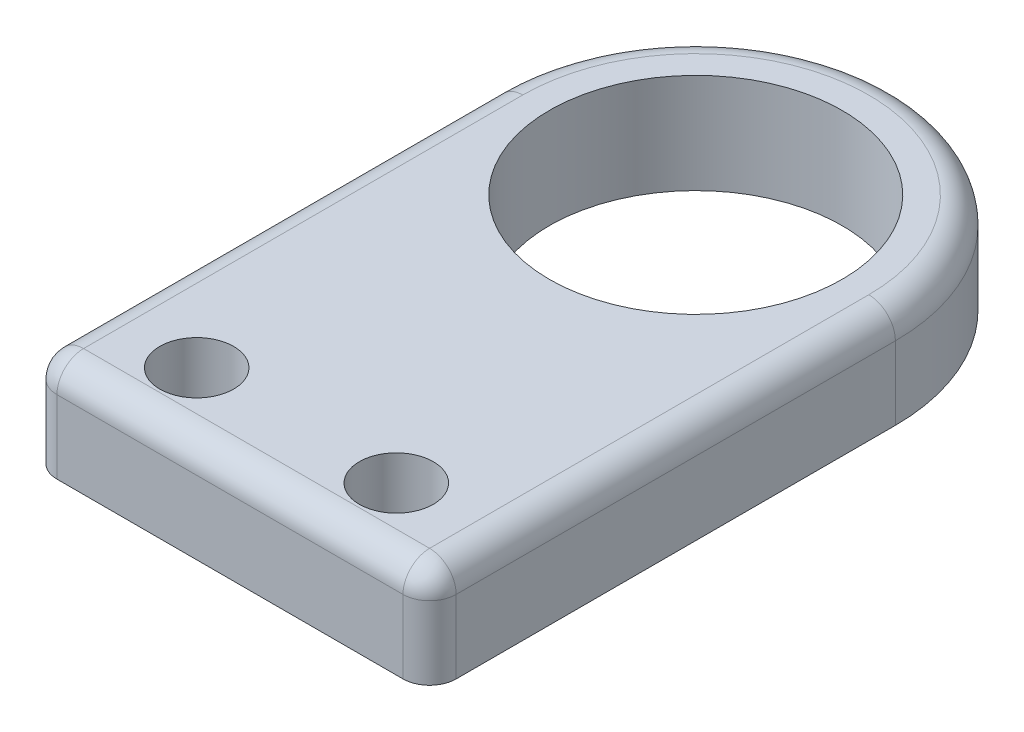
ISO-10303-21;
HEADER;
FILE_DESCRIPTION(('STEP AP214'),'2;1');
FILE_NAME('part.step','',(''),(''),'','','');
FILE_SCHEMA(('AUTOMOTIVE_DESIGN { 1 0 10303 214 1 1 1 1 }'));
ENDSEC;
DATA;
#1=APPLICATION_CONTEXT('core data for automotive mechanical design processes');
#2=APPLICATION_PROTOCOL_DEFINITION('international standard','automotive_design',2000,#1);
#3=PRODUCT_CONTEXT('',#1,'mechanical');
#4=PRODUCT('Part','Part','',(#3));
#5=PRODUCT_RELATED_PRODUCT_CATEGORY('part','',(#4));
#6=PRODUCT_DEFINITION_FORMATION('','',#4);
#7=PRODUCT_DEFINITION_CONTEXT('part definition',#1,'design');
#8=PRODUCT_DEFINITION('design','',#6,#7);
#9=PRODUCT_DEFINITION_SHAPE('','',#8);
#10=(LENGTH_UNIT() NAMED_UNIT(*) SI_UNIT(.MILLI.,.METRE.));
#11=(NAMED_UNIT(*) PLANE_ANGLE_UNIT() SI_UNIT($,.RADIAN.));
#12=(NAMED_UNIT(*) SI_UNIT($,.STERADIAN.) SOLID_ANGLE_UNIT());
#13=UNCERTAINTY_MEASURE_WITH_UNIT(LENGTH_MEASURE(1.E-05),#10,'distance_accuracy_value','');
#14=(GEOMETRIC_REPRESENTATION_CONTEXT(3) GLOBAL_UNCERTAINTY_ASSIGNED_CONTEXT((#13)) GLOBAL_UNIT_ASSIGNED_CONTEXT((#10,
#11,#12)) REPRESENTATION_CONTEXT('',''));
#15=CARTESIAN_POINT('',(0.,0.,0.));
#16=DIRECTION('',(0.,0.,1.));
#17=DIRECTION('',(1.,0.,0.));
#18=AXIS2_PLACEMENT_3D('',#15,#16,#17);
#19=CARTESIAN_POINT('',(0.,7.5,-35.));
#20=DIRECTION('',(0.,-1.,0.));
#21=DIRECTION('',(0.,0.,-1.));
#22=AXIS2_PLACEMENT_3D('',#19,#20,#21);
#23=PLANE('',#22);
#24=CARTESIAN_POINT('',(0.,7.5,-35.));
#25=DIRECTION('',(0.,-1.,0.));
#26=DIRECTION('',(0.,0.,-1.));
#27=AXIS2_PLACEMENT_3D('',#24,#25,#26);
#28=CIRCLE('',#27,13.);
#29=CARTESIAN_POINT('',(13.,7.5,-35.));
#30=VERTEX_POINT('',#29);
#31=CARTESIAN_POINT('',(-13.,7.5,-35.));
#32=VERTEX_POINT('',#31);
#33=EDGE_CURVE('E136',#30,#32,#28,.F.);
#34=ORIENTED_EDGE('',*,*,#33,.T.);
#35=DIRECTION('',(0.,0.,1.));
#36=VECTOR('',#35,1.);
#37=CARTESIAN_POINT('',(-13.,7.5,-35.));
#38=LINE('',#37,#36);
#39=CARTESIAN_POINT('',(-13.,7.5,-2.));
#40=VERTEX_POINT('',#39);
#41=EDGE_CURVE('E138',#32,#40,#38,.T.);
#42=ORIENTED_EDGE('',*,*,#41,.T.);
#43=DIRECTION('',(1.,0.,0.));
#44=VECTOR('',#43,1.);
#45=CARTESIAN_POINT('',(0.,7.5,-2.));
#46=LINE('',#45,#44);
#47=CARTESIAN_POINT('',(13.,7.5,-2.));
#48=VERTEX_POINT('',#47);
#49=EDGE_CURVE('E134',#40,#48,#46,.T.);
#50=ORIENTED_EDGE('',*,*,#49,.T.);
#51=DIRECTION('',(0.,0.,-1.));
#52=VECTOR('',#51,1.);
#53=CARTESIAN_POINT('',(13.,7.5,-35.));
#54=LINE('',#53,#52);
#55=EDGE_CURVE('E111',#48,#30,#54,.T.);
#56=ORIENTED_EDGE('',*,*,#55,.T.);
#57=EDGE_LOOP('',(#34,#42,#50,#56));
#58=FACE_BOUND('',#57,.T.);
#59=CARTESIAN_POINT('',(-7.5,7.5,-5.));
#60=DIRECTION('',(0.,1.,0.));
#61=DIRECTION('',(0.,0.,1.));
#62=AXIS2_PLACEMENT_3D('',#59,#60,#61);
#63=CIRCLE('',#62,2.77876);
#64=CARTESIAN_POINT('',(-7.5,7.5,-2.22124));
#65=VERTEX_POINT('',#64);
#66=EDGE_CURVE('E177',#65,#65,#63,.T.);
#67=ORIENTED_EDGE('',*,*,#66,.F.);
#68=EDGE_LOOP('',(#67));
#69=FACE_BOUND('',#68,.T.);
#70=CARTESIAN_POINT('',(7.5,7.5,-5.));
#71=DIRECTION('',(0.,1.,0.));
#72=DIRECTION('',(0.,0.,1.));
#73=AXIS2_PLACEMENT_3D('',#70,#71,#72);
#74=CIRCLE('',#73,2.77876);
#75=CARTESIAN_POINT('',(7.5,7.5,-2.22124));
#76=VERTEX_POINT('',#75);
#77=EDGE_CURVE('E131',#76,#76,#74,.T.);
#78=ORIENTED_EDGE('',*,*,#77,.F.);
#79=EDGE_LOOP('',(#78));
#80=FACE_BOUND('',#79,.T.);
#81=CARTESIAN_POINT('',(0.,7.5,-35.));
#82=DIRECTION('',(0.,1.,0.));
#83=DIRECTION('',(0.,0.,1.));
#84=AXIS2_PLACEMENT_3D('',#81,#82,#83);
#85=CIRCLE('',#84,11.);
#86=CARTESIAN_POINT('',(0.,7.5,-24.));
#87=VERTEX_POINT('',#86);
#88=EDGE_CURVE('E198',#87,#87,#85,.T.);
#89=ORIENTED_EDGE('',*,*,#88,.F.);
#90=EDGE_LOOP('',(#89));
#91=FACE_BOUND('',#90,.T.);
#92=ADVANCED_FACE('F32',(#58,#69,#80,#91),#23,.F.);
#93=CARTESIAN_POINT('',(0.,0.,-35.));
#94=DIRECTION('',(0.,-1.,0.));
#95=DIRECTION('',(0.,0.,-1.));
#96=AXIS2_PLACEMENT_3D('',#93,#94,#95);
#97=PLANE('',#96);
#98=CARTESIAN_POINT('',(-7.5,0.,-5.));
#99=DIRECTION('',(0.,-1.,0.));
#100=DIRECTION('',(0.,0.,-1.));
#101=AXIS2_PLACEMENT_3D('',#98,#99,#100);
#102=CIRCLE('',#101,1.2192);
#103=CARTESIAN_POINT('',(-7.5,0.,-6.2192));
#104=VERTEX_POINT('',#103);
#105=EDGE_CURVE('E128',#104,#104,#102,.T.);
#106=ORIENTED_EDGE('',*,*,#105,.F.);
#107=EDGE_LOOP('',(#106));
#108=FACE_BOUND('',#107,.T.);
#109=CARTESIAN_POINT('',(7.5,0.,-5.));
#110=DIRECTION('',(0.,-1.,0.));
#111=DIRECTION('',(0.,0.,-1.));
#112=AXIS2_PLACEMENT_3D('',#109,#110,#111);
#113=CIRCLE('',#112,1.2192);
#114=CARTESIAN_POINT('',(7.5,0.,-6.2192));
#115=VERTEX_POINT('',#114);
#116=EDGE_CURVE('E123',#115,#115,#113,.T.);
#117=ORIENTED_EDGE('',*,*,#116,.F.);
#118=EDGE_LOOP('',(#117));
#119=FACE_BOUND('',#118,.T.);
#120=DIRECTION('',(1.,0.,0.));
#121=VECTOR('',#120,1.);
#122=CARTESIAN_POINT('',(-15.,0.,0.));
#123=LINE('',#122,#121);
#124=CARTESIAN_POINT('',(-13.,0.,0.));
#125=VERTEX_POINT('',#124);
#126=CARTESIAN_POINT('',(13.,0.,0.));
#127=VERTEX_POINT('',#126);
#128=EDGE_CURVE('E102',#125,#127,#123,.T.);
#129=ORIENTED_EDGE('',*,*,#128,.F.);
#130=CARTESIAN_POINT('',(-13.,0.,-2.));
#131=DIRECTION('',(0.,-1.,0.));
#132=DIRECTION('',(0.,0.,-1.));
#133=AXIS2_PLACEMENT_3D('',#130,#131,#132);
#134=CIRCLE('',#133,2.);
#135=CARTESIAN_POINT('',(-15.,0.,-2.));
#136=VERTEX_POINT('',#135);
#137=EDGE_CURVE('E11',#125,#136,#134,.T.);
#138=ORIENTED_EDGE('',*,*,#137,.T.);
#139=DIRECTION('',(0.,0.,1.));
#140=VECTOR('',#139,1.);
#141=CARTESIAN_POINT('',(-15.,0.,0.));
#142=LINE('',#141,#140);
#143=CARTESIAN_POINT('',(-15.,0.,-35.));
#144=VERTEX_POINT('',#143);
#145=EDGE_CURVE('E118',#144,#136,#142,.T.);
#146=ORIENTED_EDGE('',*,*,#145,.F.);
#147=CARTESIAN_POINT('',(0.,0.,-35.));
#148=DIRECTION('',(0.,1.,0.));
#149=DIRECTION('',(0.,0.,-1.));
#150=AXIS2_PLACEMENT_3D('',#147,#148,#149);
#151=CIRCLE('',#150,15.);
#152=CARTESIAN_POINT('',(15.,0.,-35.));
#153=VERTEX_POINT('',#152);
#154=EDGE_CURVE('E101',#153,#144,#151,.T.);
#155=ORIENTED_EDGE('',*,*,#154,.F.);
#156=DIRECTION('',(0.,0.,-1.));
#157=VECTOR('',#156,1.);
#158=CARTESIAN_POINT('',(15.,0.,0.));
#159=LINE('',#158,#157);
#160=CARTESIAN_POINT('',(15.,0.,-2.00000000000001));
#161=VERTEX_POINT('',#160);
#162=EDGE_CURVE('E94',#161,#153,#159,.T.);
#163=ORIENTED_EDGE('',*,*,#162,.F.);
#164=CARTESIAN_POINT('',(13.,0.,-2.00000000000001));
#165=DIRECTION('',(0.,-1.,0.));
#166=DIRECTION('',(0.,0.,-1.));
#167=AXIS2_PLACEMENT_3D('',#164,#165,#166);
#168=CIRCLE('',#167,2.);
#169=EDGE_CURVE('E41',#161,#127,#168,.T.);
#170=ORIENTED_EDGE('',*,*,#169,.T.);
#171=EDGE_LOOP('',(#129,#138,#146,#155,#163,#170));
#172=FACE_BOUND('',#171,.T.);
#173=CARTESIAN_POINT('',(0.,0.,-35.));
#174=DIRECTION('',(0.,1.,0.));
#175=DIRECTION('',(0.,0.,1.));
#176=AXIS2_PLACEMENT_3D('',#173,#174,#175);
#177=CIRCLE('',#176,11.);
#178=CARTESIAN_POINT('',(0.,0.,-24.));
#179=VERTEX_POINT('',#178);
#180=EDGE_CURVE('E126',#179,#179,#177,.T.);
#181=ORIENTED_EDGE('',*,*,#180,.T.);
#182=EDGE_LOOP('',(#181));
#183=FACE_BOUND('',#182,.T.);
#184=ADVANCED_FACE('F115',(#108,#119,#172,#183),#97,.T.);
#185=CARTESIAN_POINT('',(-15.,7.5,0.));
#186=DIRECTION('',(1.,0.,0.));
#187=DIRECTION('',(0.,0.,-1.));
#188=AXIS2_PLACEMENT_3D('',#185,#186,#187);
#189=PLANE('',#188);
#190=DIRECTION('',(0.,-1.,0.));
#191=VECTOR('',#190,1.);
#192=CARTESIAN_POINT('',(-15.,7.5,-2.));
#193=LINE('',#192,#191);
#194=CARTESIAN_POINT('',(-15.,5.5,-2.));
#195=VERTEX_POINT('',#194);
#196=EDGE_CURVE('E141',#136,#195,#193,.F.);
#197=ORIENTED_EDGE('',*,*,#196,.T.);
#198=DIRECTION('',(0.,0.,1.));
#199=VECTOR('',#198,1.);
#200=CARTESIAN_POINT('',(-15.,5.5,0.));
#201=LINE('',#200,#199);
#202=CARTESIAN_POINT('',(-15.,5.5,-35.));
#203=VERTEX_POINT('',#202);
#204=EDGE_CURVE('E143',#195,#203,#201,.F.);
#205=ORIENTED_EDGE('',*,*,#204,.T.);
#206=DIRECTION('',(0.,-1.,0.));
#207=VECTOR('',#206,1.);
#208=CARTESIAN_POINT('',(-15.,7.5,-35.));
#209=LINE('',#208,#207);
#210=EDGE_CURVE('E112',#203,#144,#209,.T.);
#211=ORIENTED_EDGE('',*,*,#210,.T.);
#212=ORIENTED_EDGE('',*,*,#145,.T.);
#213=EDGE_LOOP('',(#197,#205,#211,#212));
#214=FACE_BOUND('',#213,.T.);
#215=ADVANCED_FACE('F222',(#214),#189,.F.);
#216=CARTESIAN_POINT('',(-15.,7.5,0.));
#217=DIRECTION('',(0.,0.,-1.));
#218=DIRECTION('',(-1.,0.,0.));
#219=AXIS2_PLACEMENT_3D('',#216,#217,#218);
#220=PLANE('',#219);
#221=DIRECTION('',(1.,0.,0.));
#222=VECTOR('',#221,1.);
#223=CARTESIAN_POINT('',(-15.,5.5,0.));
#224=LINE('',#223,#222);
#225=CARTESIAN_POINT('',(13.,5.5,0.));
#226=VERTEX_POINT('',#225);
#227=CARTESIAN_POINT('',(-13.,5.5,0.));
#228=VERTEX_POINT('',#227);
#229=EDGE_CURVE('E149',#226,#228,#224,.F.);
#230=ORIENTED_EDGE('',*,*,#229,.T.);
#231=DIRECTION('',(0.,-1.,0.));
#232=VECTOR('',#231,1.);
#233=CARTESIAN_POINT('',(-13.,7.5,0.));
#234=LINE('',#233,#232);
#235=EDGE_CURVE('E151',#228,#125,#234,.T.);
#236=ORIENTED_EDGE('',*,*,#235,.T.);
#237=ORIENTED_EDGE('',*,*,#128,.T.);
#238=DIRECTION('',(0.,-1.,0.));
#239=VECTOR('',#238,1.);
#240=CARTESIAN_POINT('',(13.,7.5,0.));
#241=LINE('',#240,#239);
#242=EDGE_CURVE('E147',#127,#226,#241,.F.);
#243=ORIENTED_EDGE('',*,*,#242,.T.);
#244=EDGE_LOOP('',(#230,#236,#237,#243));
#245=FACE_BOUND('',#244,.T.);
#246=ADVANCED_FACE('F206',(#245),#220,.F.);
#247=CARTESIAN_POINT('',(15.,7.5,0.));
#248=DIRECTION('',(-1.,0.,0.));
#249=DIRECTION('',(0.,0.,1.));
#250=AXIS2_PLACEMENT_3D('',#247,#248,#249);
#251=PLANE('',#250);
#252=DIRECTION('',(0.,-1.,0.));
#253=VECTOR('',#252,1.);
#254=CARTESIAN_POINT('',(15.,7.5,-35.));
#255=LINE('',#254,#253);
#256=CARTESIAN_POINT('',(15.,5.5,-35.));
#257=VERTEX_POINT('',#256);
#258=EDGE_CURVE('E97',#257,#153,#255,.T.);
#259=ORIENTED_EDGE('',*,*,#258,.F.);
#260=DIRECTION('',(0.,0.,-1.));
#261=VECTOR('',#260,1.);
#262=CARTESIAN_POINT('',(15.,5.5,0.));
#263=LINE('',#262,#261);
#264=CARTESIAN_POINT('',(15.,5.5,-2.00000000000001));
#265=VERTEX_POINT('',#264);
#266=EDGE_CURVE('E49',#257,#265,#263,.F.);
#267=ORIENTED_EDGE('',*,*,#266,.T.);
#268=DIRECTION('',(0.,-1.,0.));
#269=VECTOR('',#268,1.);
#270=CARTESIAN_POINT('',(15.,7.5,-2.00000000000001));
#271=LINE('',#270,#269);
#272=EDGE_CURVE('E53',#265,#161,#271,.T.);
#273=ORIENTED_EDGE('',*,*,#272,.T.);
#274=ORIENTED_EDGE('',*,*,#162,.T.);
#275=EDGE_LOOP('',(#259,#267,#273,#274));
#276=FACE_BOUND('',#275,.T.);
#277=ADVANCED_FACE('F96',(#276),#251,.F.);
#278=CARTESIAN_POINT('',(0.,7.5,-35.));
#279=DIRECTION('',(0.,-1.,0.));
#280=DIRECTION('',(0.,0.,-1.));
#281=AXIS2_PLACEMENT_3D('',#278,#279,#280);
#282=CYLINDRICAL_SURFACE('',#281,15.);
#283=ORIENTED_EDGE('',*,*,#210,.F.);
#284=CARTESIAN_POINT('',(0.,5.5,-35.));
#285=DIRECTION('',(0.,-1.,0.));
#286=DIRECTION('',(0.,0.,-1.));
#287=AXIS2_PLACEMENT_3D('',#284,#285,#286);
#288=CIRCLE('',#287,15.);
#289=EDGE_CURVE('E110',#203,#257,#288,.T.);
#290=ORIENTED_EDGE('',*,*,#289,.T.);
#291=ORIENTED_EDGE('',*,*,#258,.T.);
#292=ORIENTED_EDGE('',*,*,#154,.T.);
#293=EDGE_LOOP('',(#283,#290,#291,#292));
#294=FACE_BOUND('',#293,.T.);
#295=ADVANCED_FACE('F107',(#294),#282,.T.);
#296=CARTESIAN_POINT('',(0.,7.5,-35.));
#297=DIRECTION('',(0.,-1.,0.));
#298=DIRECTION('',(0.,0.,-1.));
#299=AXIS2_PLACEMENT_3D('',#296,#297,#298);
#300=CYLINDRICAL_SURFACE('',#299,11.);
#301=ORIENTED_EDGE('',*,*,#88,.T.);
#302=EDGE_LOOP('',(#301));
#303=FACE_BOUND('',#302,.T.);
#304=ORIENTED_EDGE('',*,*,#180,.F.);
#305=EDGE_LOOP('',(#304));
#306=FACE_BOUND('',#305,.T.);
#307=ADVANCED_FACE('F252',(#303,#306),#300,.F.);
#308=CARTESIAN_POINT('',(7.5,7.5,-5.));
#309=DIRECTION('',(0.,1.,0.));
#310=DIRECTION('',(0.,0.,1.));
#311=AXIS2_PLACEMENT_3D('',#308,#309,#310);
#312=CYLINDRICAL_SURFACE('',#311,1.2192);
#313=ORIENTED_EDGE('',*,*,#116,.T.);
#314=EDGE_LOOP('',(#313));
#315=FACE_BOUND('',#314,.T.);
#316=CARTESIAN_POINT('',(7.5,2.500000094,-5.));
#317=DIRECTION('',(0.,1.,0.));
#318=DIRECTION('',(0.,0.,1.));
#319=AXIS2_PLACEMENT_3D('',#316,#317,#318);
#320=CIRCLE('',#319,1.2192);
#321=CARTESIAN_POINT('',(7.5,2.500000094,-3.7808));
#322=VERTEX_POINT('',#321);
#323=EDGE_CURVE('E127',#322,#322,#320,.T.);
#324=ORIENTED_EDGE('',*,*,#323,.T.);
#325=EDGE_LOOP('',(#324));
#326=FACE_BOUND('',#325,.T.);
#327=ADVANCED_FACE('F359',(#315,#326),#312,.F.);
#328=CARTESIAN_POINT('',(8.7192,2.500000094,-5.));
#329=DIRECTION('',(0.,-1.,0.));
#330=DIRECTION('',(0.,0.,-1.));
#331=AXIS2_PLACEMENT_3D('',#328,#329,#330);
#332=PLANE('',#331);
#333=ORIENTED_EDGE('',*,*,#323,.F.);
#334=EDGE_LOOP('',(#333));
#335=FACE_BOUND('',#334,.T.);
#336=CARTESIAN_POINT('',(7.5,2.500000094,-5.));
#337=DIRECTION('',(0.,1.,0.));
#338=DIRECTION('',(0.,0.,1.));
#339=AXIS2_PLACEMENT_3D('',#336,#337,#338);
#340=CIRCLE('',#339,2.77876);
#341=CARTESIAN_POINT('',(7.5,2.500000094,-2.22124));
#342=VERTEX_POINT('',#341);
#343=EDGE_CURVE('E193',#342,#342,#340,.T.);
#344=ORIENTED_EDGE('',*,*,#343,.T.);
#345=EDGE_LOOP('',(#344));
#346=FACE_BOUND('',#345,.T.);
#347=ADVANCED_FACE('F350',(#335,#346),#332,.F.);
#348=CARTESIAN_POINT('',(7.5,7.5,-5.));
#349=DIRECTION('',(0.,1.,0.));
#350=DIRECTION('',(0.,0.,1.));
#351=AXIS2_PLACEMENT_3D('',#348,#349,#350);
#352=CYLINDRICAL_SURFACE('',#351,2.77876);
#353=ORIENTED_EDGE('',*,*,#343,.F.);
#354=EDGE_LOOP('',(#353));
#355=FACE_BOUND('',#354,.T.);
#356=ORIENTED_EDGE('',*,*,#77,.T.);
#357=EDGE_LOOP('',(#356));
#358=FACE_BOUND('',#357,.T.);
#359=ADVANCED_FACE('F341',(#355,#358),#352,.F.);
#360=CARTESIAN_POINT('',(-7.5,7.5,-5.));
#361=DIRECTION('',(0.,1.,0.));
#362=DIRECTION('',(0.,0.,1.));
#363=AXIS2_PLACEMENT_3D('',#360,#361,#362);
#364=CYLINDRICAL_SURFACE('',#363,1.2192);
#365=ORIENTED_EDGE('',*,*,#105,.T.);
#366=EDGE_LOOP('',(#365));
#367=FACE_BOUND('',#366,.T.);
#368=CARTESIAN_POINT('',(-7.5,2.500000094,-5.));
#369=DIRECTION('',(0.,1.,0.));
#370=DIRECTION('',(0.,0.,1.));
#371=AXIS2_PLACEMENT_3D('',#368,#369,#370);
#372=CIRCLE('',#371,1.2192);
#373=CARTESIAN_POINT('',(-7.5,2.500000094,-3.7808));
#374=VERTEX_POINT('',#373);
#375=EDGE_CURVE('E132',#374,#374,#372,.T.);
#376=ORIENTED_EDGE('',*,*,#375,.T.);
#377=EDGE_LOOP('',(#376));
#378=FACE_BOUND('',#377,.T.);
#379=ADVANCED_FACE('F332',(#367,#378),#364,.F.);
#380=CARTESIAN_POINT('',(-6.2808,2.500000094,-5.));
#381=DIRECTION('',(0.,-1.,0.));
#382=DIRECTION('',(0.,0.,-1.));
#383=AXIS2_PLACEMENT_3D('',#380,#381,#382);
#384=PLANE('',#383);
#385=ORIENTED_EDGE('',*,*,#375,.F.);
#386=EDGE_LOOP('',(#385));
#387=FACE_BOUND('',#386,.T.);
#388=CARTESIAN_POINT('',(-7.5,2.500000094,-5.));
#389=DIRECTION('',(0.,1.,0.));
#390=DIRECTION('',(0.,0.,1.));
#391=AXIS2_PLACEMENT_3D('',#388,#389,#390);
#392=CIRCLE('',#391,2.77876);
#393=CARTESIAN_POINT('',(-7.5,2.500000094,-2.22124));
#394=VERTEX_POINT('',#393);
#395=EDGE_CURVE('E182',#394,#394,#392,.T.);
#396=ORIENTED_EDGE('',*,*,#395,.T.);
#397=EDGE_LOOP('',(#396));
#398=FACE_BOUND('',#397,.T.);
#399=ADVANCED_FACE('F323',(#387,#398),#384,.F.);
#400=CARTESIAN_POINT('',(-7.5,7.5,-5.));
#401=DIRECTION('',(0.,1.,0.));
#402=DIRECTION('',(0.,0.,1.));
#403=AXIS2_PLACEMENT_3D('',#400,#401,#402);
#404=CYLINDRICAL_SURFACE('',#403,2.77876);
#405=ORIENTED_EDGE('',*,*,#395,.F.);
#406=EDGE_LOOP('',(#405));
#407=FACE_BOUND('',#406,.T.);
#408=ORIENTED_EDGE('',*,*,#66,.T.);
#409=EDGE_LOOP('',(#408));
#410=FACE_BOUND('',#409,.T.);
#411=ADVANCED_FACE('F315',(#407,#410),#404,.F.);
#412=CARTESIAN_POINT('',(13.,7.5,-2.00000000000001));
#413=DIRECTION('',(0.,-1.,0.));
#414=DIRECTION('',(0.,0.,-1.));
#415=AXIS2_PLACEMENT_3D('',#412,#413,#414);
#416=CYLINDRICAL_SURFACE('',#415,2.);
#417=CARTESIAN_POINT('',(13.,5.5,-2.00000000000001));
#418=DIRECTION('',(0.,1.,0.));
#419=DIRECTION('',(0.,0.,1.));
#420=AXIS2_PLACEMENT_3D('',#417,#418,#419);
#421=CIRCLE('',#420,2.);
#422=EDGE_CURVE('E36',#226,#265,#421,.T.);
#423=ORIENTED_EDGE('',*,*,#422,.F.);
#424=ORIENTED_EDGE('',*,*,#242,.F.);
#425=ORIENTED_EDGE('',*,*,#169,.F.);
#426=ORIENTED_EDGE('',*,*,#272,.F.);
#427=EDGE_LOOP('',(#423,#424,#425,#426));
#428=FACE_BOUND('',#427,.T.);
#429=ADVANCED_FACE('F34',(#428),#416,.T.);
#430=CARTESIAN_POINT('',(13.,5.5,-2.00000000000001));
#431=DIRECTION('',(0.,0.,1.));
#432=DIRECTION('',(1.,0.,0.));
#433=AXIS2_PLACEMENT_3D('',#430,#431,#432);
#434=SPHERICAL_SURFACE('',#433,2.);
#435=CARTESIAN_POINT('',(13.,5.5,-2.));
#436=DIRECTION('',(1.,0.,0.));
#437=DIRECTION('',(0.,0.,-1.));
#438=AXIS2_PLACEMENT_3D('',#435,#436,#437);
#439=CIRCLE('',#438,2.);
#440=EDGE_CURVE('E169',#226,#48,#439,.F.);
#441=ORIENTED_EDGE('',*,*,#440,.F.);
#442=ORIENTED_EDGE('',*,*,#422,.T.);
#443=CARTESIAN_POINT('',(13.,5.5,-2.00000000000001));
#444=DIRECTION('',(0.,0.,1.));
#445=DIRECTION('',(0.,-1.,0.));
#446=AXIS2_PLACEMENT_3D('',#443,#444,#445);
#447=CIRCLE('',#446,2.);
#448=EDGE_CURVE('E171',#48,#265,#447,.F.);
#449=ORIENTED_EDGE('',*,*,#448,.F.);
#450=EDGE_LOOP('',(#441,#442,#449));
#451=FACE_BOUND('',#450,.T.);
#452=ADVANCED_FACE('F211',(#451),#434,.T.);
#453=CARTESIAN_POINT('',(13.,5.5,-35.));
#454=DIRECTION('',(0.,0.,-1.));
#455=DIRECTION('',(-1.,0.,0.));
#456=AXIS2_PLACEMENT_3D('',#453,#454,#455);
#457=CYLINDRICAL_SURFACE('',#456,2.);
#458=ORIENTED_EDGE('',*,*,#448,.T.);
#459=ORIENTED_EDGE('',*,*,#266,.F.);
#460=CARTESIAN_POINT('',(13.,5.5,-35.));
#461=DIRECTION('',(0.,0.,-1.));
#462=DIRECTION('',(-1.,0.,0.));
#463=AXIS2_PLACEMENT_3D('',#460,#461,#462);
#464=CIRCLE('',#463,2.);
#465=EDGE_CURVE('E166',#30,#257,#464,.T.);
#466=ORIENTED_EDGE('',*,*,#465,.F.);
#467=ORIENTED_EDGE('',*,*,#55,.F.);
#468=EDGE_LOOP('',(#458,#459,#466,#467));
#469=FACE_BOUND('',#468,.T.);
#470=ADVANCED_FACE('F236',(#469),#457,.T.);
#471=CARTESIAN_POINT('',(0.,5.5,-2.));
#472=DIRECTION('',(1.,0.,0.));
#473=DIRECTION('',(0.,0.,-1.));
#474=AXIS2_PLACEMENT_3D('',#471,#472,#473);
#475=CYLINDRICAL_SURFACE('',#474,2.);
#476=ORIENTED_EDGE('',*,*,#440,.T.);
#477=ORIENTED_EDGE('',*,*,#49,.F.);
#478=CARTESIAN_POINT('',(-13.,5.5,-2.));
#479=DIRECTION('',(-1.,0.,0.));
#480=DIRECTION('',(0.,0.,1.));
#481=AXIS2_PLACEMENT_3D('',#478,#479,#480);
#482=CIRCLE('',#481,2.);
#483=EDGE_CURVE('E163',#228,#40,#482,.T.);
#484=ORIENTED_EDGE('',*,*,#483,.F.);
#485=ORIENTED_EDGE('',*,*,#229,.F.);
#486=EDGE_LOOP('',(#476,#477,#484,#485));
#487=FACE_BOUND('',#486,.T.);
#488=ADVANCED_FACE('F215',(#487),#475,.T.);
#489=CARTESIAN_POINT('',(-13.,7.5,-2.));
#490=DIRECTION('',(0.,-1.,0.));
#491=DIRECTION('',(0.,0.,-1.));
#492=AXIS2_PLACEMENT_3D('',#489,#490,#491);
#493=CYLINDRICAL_SURFACE('',#492,2.);
#494=ORIENTED_EDGE('',*,*,#137,.F.);
#495=ORIENTED_EDGE('',*,*,#235,.F.);
#496=CARTESIAN_POINT('',(-13.,5.5,-2.));
#497=DIRECTION('',(0.,1.,0.));
#498=DIRECTION('',(0.,0.,1.));
#499=AXIS2_PLACEMENT_3D('',#496,#497,#498);
#500=CIRCLE('',#499,2.);
#501=EDGE_CURVE('E160',#195,#228,#500,.T.);
#502=ORIENTED_EDGE('',*,*,#501,.F.);
#503=ORIENTED_EDGE('',*,*,#196,.F.);
#504=EDGE_LOOP('',(#494,#495,#502,#503));
#505=FACE_BOUND('',#504,.T.);
#506=ADVANCED_FACE('F218',(#505),#493,.T.);
#507=CARTESIAN_POINT('',(0.,5.5,-35.));
#508=DIRECTION('',(0.,-1.,0.));
#509=DIRECTION('',(0.,0.,-1.));
#510=AXIS2_PLACEMENT_3D('',#507,#508,#509);
#511=TOROIDAL_SURFACE('',#510,13.,2.);
#512=ORIENTED_EDGE('',*,*,#465,.T.);
#513=ORIENTED_EDGE('',*,*,#289,.F.);
#514=CARTESIAN_POINT('',(-13.,5.5,-35.));
#515=DIRECTION('',(0.,0.,1.));
#516=DIRECTION('',(1.,0.,0.));
#517=AXIS2_PLACEMENT_3D('',#514,#515,#516);
#518=CIRCLE('',#517,2.);
#519=EDGE_CURVE('E158',#32,#203,#518,.T.);
#520=ORIENTED_EDGE('',*,*,#519,.F.);
#521=ORIENTED_EDGE('',*,*,#33,.F.);
#522=EDGE_LOOP('',(#512,#513,#520,#521));
#523=FACE_BOUND('',#522,.T.);
#524=ADVANCED_FACE('F235',(#523),#511,.T.);
#525=CARTESIAN_POINT('',(-13.,5.5,-2.));
#526=DIRECTION('',(0.,0.,1.));
#527=DIRECTION('',(1.,0.,0.));
#528=AXIS2_PLACEMENT_3D('',#525,#526,#527);
#529=SPHERICAL_SURFACE('',#528,2.);
#530=ORIENTED_EDGE('',*,*,#501,.T.);
#531=ORIENTED_EDGE('',*,*,#483,.T.);
#532=CARTESIAN_POINT('',(-13.,5.5,-2.));
#533=DIRECTION('',(0.,0.,1.));
#534=DIRECTION('',(1.,0.,0.));
#535=AXIS2_PLACEMENT_3D('',#532,#533,#534);
#536=CIRCLE('',#535,2.);
#537=EDGE_CURVE('E156',#195,#40,#536,.F.);
#538=ORIENTED_EDGE('',*,*,#537,.F.);
#539=EDGE_LOOP('',(#530,#531,#538));
#540=FACE_BOUND('',#539,.T.);
#541=ADVANCED_FACE('F229',(#540),#529,.T.);
#542=CARTESIAN_POINT('',(-13.,5.5,-35.));
#543=DIRECTION('',(0.,0.,1.));
#544=DIRECTION('',(1.,0.,0.));
#545=AXIS2_PLACEMENT_3D('',#542,#543,#544);
#546=CYLINDRICAL_SURFACE('',#545,2.);
#547=ORIENTED_EDGE('',*,*,#519,.T.);
#548=ORIENTED_EDGE('',*,*,#204,.F.);
#549=ORIENTED_EDGE('',*,*,#537,.T.);
#550=ORIENTED_EDGE('',*,*,#41,.F.);
#551=EDGE_LOOP('',(#547,#548,#549,#550));
#552=FACE_BOUND('',#551,.T.);
#553=ADVANCED_FACE('F225',(#552),#546,.T.);
#554=CLOSED_SHELL('',(#92,#184,#215,#246,#277,#295,#307,#327,#347,#359,#379,#399,#411,#429,#452,
#470,#488,#506,#524,#541,#553));
#555=MANIFOLD_SOLID_BREP('B2',#554);
#556=ADVANCED_BREP_SHAPE_REPRESENTATION('',(#18,#555),#14);
#557=SHAPE_DEFINITION_REPRESENTATION(#9,#556);
ENDSEC;
END-ISO-10303-21;
